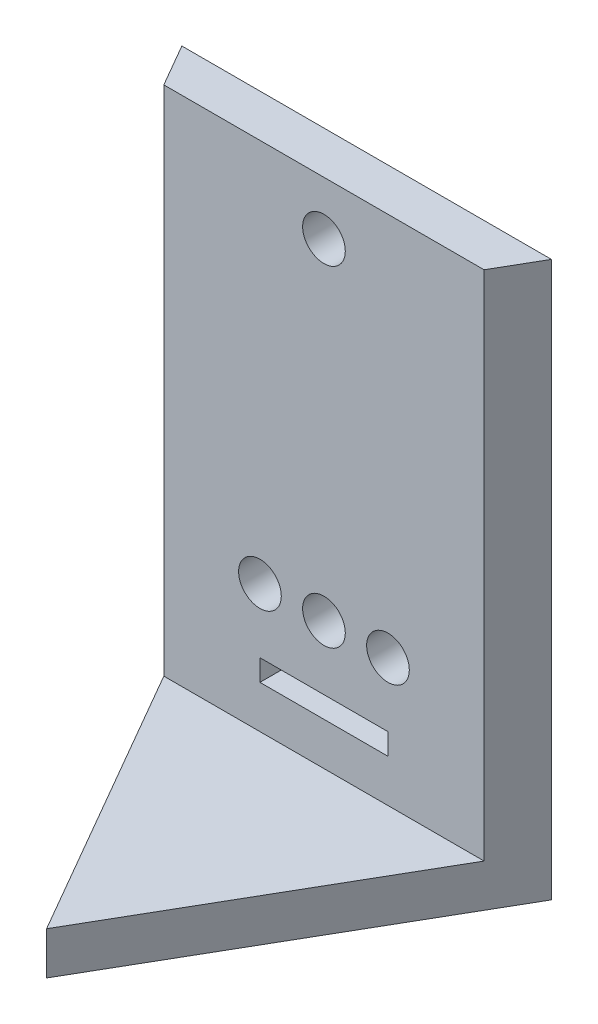
ISO-10303-21;
HEADER;
FILE_DESCRIPTION(('STEP AP214'),'2;1');
FILE_NAME('part.step','',(''),(''),'','','');
FILE_SCHEMA(('AUTOMOTIVE_DESIGN { 1 0 10303 214 1 1 1 1 }'));
ENDSEC;
DATA;
#1=APPLICATION_CONTEXT('core data for automotive mechanical design processes');
#2=APPLICATION_PROTOCOL_DEFINITION('international standard','automotive_design',2000,#1);
#3=PRODUCT_CONTEXT('',#1,'mechanical');
#4=PRODUCT('Part','Part','',(#3));
#5=PRODUCT_RELATED_PRODUCT_CATEGORY('part','',(#4));
#6=PRODUCT_DEFINITION_FORMATION('','',#4);
#7=PRODUCT_DEFINITION_CONTEXT('part definition',#1,'design');
#8=PRODUCT_DEFINITION('design','',#6,#7);
#9=PRODUCT_DEFINITION_SHAPE('','',#8);
#10=(LENGTH_UNIT() NAMED_UNIT(*) SI_UNIT(.MILLI.,.METRE.));
#11=(NAMED_UNIT(*) PLANE_ANGLE_UNIT() SI_UNIT($,.RADIAN.));
#12=(NAMED_UNIT(*) SI_UNIT($,.STERADIAN.) SOLID_ANGLE_UNIT());
#13=UNCERTAINTY_MEASURE_WITH_UNIT(LENGTH_MEASURE(1.E-05),#10,'distance_accuracy_value','');
#14=(GEOMETRIC_REPRESENTATION_CONTEXT(3) GLOBAL_UNCERTAINTY_ASSIGNED_CONTEXT((#13)) GLOBAL_UNIT_ASSIGNED_CONTEXT((#10,
#11,#12)) REPRESENTATION_CONTEXT('',''));
#15=CARTESIAN_POINT('',(0.,0.,0.));
#16=DIRECTION('',(0.,0.,1.));
#17=DIRECTION('',(1.,0.,0.));
#18=AXIS2_PLACEMENT_3D('',#15,#16,#17);
#19=CARTESIAN_POINT('',(43.3012701892219,130.,-75.));
#20=DIRECTION('',(0.,0.,1.));
#21=DIRECTION('',(1.,0.,0.));
#22=AXIS2_PLACEMENT_3D('',#19,#20,#21);
#23=PLANE('',#22);
#24=CARTESIAN_POINT('',(10.,110.,-75.));
#25=DIRECTION('',(0.,0.,1.));
#26=DIRECTION('',(1.,0.,0.));
#27=AXIS2_PLACEMENT_3D('',#24,#25,#26);
#28=CIRCLE('',#27,1.25);
#29=CARTESIAN_POINT('',(11.25,110.,-75.));
#30=VERTEX_POINT('',#29);
#31=EDGE_CURVE('E44',#30,#30,#28,.F.);
#32=ORIENTED_EDGE('',*,*,#31,.F.);
#33=EDGE_LOOP('',(#32));
#34=FACE_BOUND('',#33,.T.);
#35=CARTESIAN_POINT('',(0.,117.5,-75.));
#36=DIRECTION('',(0.,0.,-1.));
#37=DIRECTION('',(-1.,0.,0.));
#38=AXIS2_PLACEMENT_3D('',#35,#36,#37);
#39=CIRCLE('',#38,5.);
#40=CARTESIAN_POINT('',(-5.,117.5,-75.));
#41=VERTEX_POINT('',#40);
#42=EDGE_CURVE('E224',#41,#41,#39,.T.);
#43=ORIENTED_EDGE('',*,*,#42,.F.);
#44=EDGE_LOOP('',(#43));
#45=FACE_BOUND('',#44,.T.);
#46=DIRECTION('',(1.,0.,0.));
#47=VECTOR('',#46,1.);
#48=CARTESIAN_POINT('',(15.,25.,-75.));
#49=LINE('',#48,#47);
#50=CARTESIAN_POINT('',(-15.,25.,-75.));
#51=VERTEX_POINT('',#50);
#52=CARTESIAN_POINT('',(15.,25.,-75.));
#53=VERTEX_POINT('',#52);
#54=EDGE_CURVE('E126',#51,#53,#49,.T.);
#55=ORIENTED_EDGE('',*,*,#54,.F.);
#56=DIRECTION('',(0.,1.,0.));
#57=VECTOR('',#56,1.);
#58=CARTESIAN_POINT('',(-15.,20.,-75.));
#59=LINE('',#58,#57);
#60=CARTESIAN_POINT('',(-15.,20.,-75.));
#61=VERTEX_POINT('',#60);
#62=EDGE_CURVE('E51',#61,#51,#59,.T.);
#63=ORIENTED_EDGE('',*,*,#62,.F.);
#64=DIRECTION('',(-1.,0.,0.));
#65=VECTOR('',#64,1.);
#66=CARTESIAN_POINT('',(15.,20.,-75.));
#67=LINE('',#66,#65);
#68=CARTESIAN_POINT('',(15.,20.,-75.));
#69=VERTEX_POINT('',#68);
#70=EDGE_CURVE('E119',#69,#61,#67,.T.);
#71=ORIENTED_EDGE('',*,*,#70,.F.);
#72=DIRECTION('',(0.,-1.,0.));
#73=VECTOR('',#72,1.);
#74=CARTESIAN_POINT('',(15.,20.,-75.));
#75=LINE('',#74,#73);
#76=EDGE_CURVE('E134',#53,#69,#75,.T.);
#77=ORIENTED_EDGE('',*,*,#76,.F.);
#78=EDGE_LOOP('',(#55,#63,#71,#77));
#79=FACE_BOUND('',#78,.T.);
#80=CARTESIAN_POINT('',(-15.0000000000002,40.,-75.));
#81=DIRECTION('',(0.,0.,-1.));
#82=DIRECTION('',(-1.,0.,0.));
#83=AXIS2_PLACEMENT_3D('',#80,#81,#82);
#84=CIRCLE('',#83,5.);
#85=CARTESIAN_POINT('',(-20.0000000000002,40.,-75.));
#86=VERTEX_POINT('',#85);
#87=EDGE_CURVE('E144',#86,#86,#84,.T.);
#88=ORIENTED_EDGE('',*,*,#87,.F.);
#89=EDGE_LOOP('',(#88));
#90=FACE_BOUND('',#89,.T.);
#91=CARTESIAN_POINT('',(-2.22044604925031E-13,40.,-75.));
#92=DIRECTION('',(0.,0.,-1.));
#93=DIRECTION('',(-1.,0.,0.));
#94=AXIS2_PLACEMENT_3D('',#91,#92,#93);
#95=CIRCLE('',#94,5.00000000000001);
#96=CARTESIAN_POINT('',(-5.00000000000023,40.,-75.));
#97=VERTEX_POINT('',#96);
#98=EDGE_CURVE('E150',#97,#97,#95,.T.);
#99=ORIENTED_EDGE('',*,*,#98,.F.);
#100=EDGE_LOOP('',(#99));
#101=FACE_BOUND('',#100,.T.);
#102=CARTESIAN_POINT('',(14.9999999999998,40.,-75.));
#103=DIRECTION('',(0.,0.,-1.));
#104=DIRECTION('',(-1.,0.,0.));
#105=AXIS2_PLACEMENT_3D('',#102,#103,#104);
#106=CIRCLE('',#105,5.);
#107=CARTESIAN_POINT('',(9.99999999999978,40.,-75.));
#108=VERTEX_POINT('',#107);
#109=EDGE_CURVE('E157',#108,#108,#106,.T.);
#110=ORIENTED_EDGE('',*,*,#109,.F.);
#111=EDGE_LOOP('',(#110));
#112=FACE_BOUND('',#111,.T.);
#113=DIRECTION('',(-1.,0.,0.));
#114=VECTOR('',#113,1.);
#115=CARTESIAN_POINT('',(43.3012701892219,0.,-75.));
#116=LINE('',#115,#114);
#117=CARTESIAN_POINT('',(43.3012701892216,0.,-74.9999999999998));
#118=VERTEX_POINT('',#117);
#119=CARTESIAN_POINT('',(-43.3012701892221,0.,-74.9999999999995));
#120=VERTEX_POINT('',#119);
#121=EDGE_CURVE('E181',#118,#120,#116,.T.);
#122=ORIENTED_EDGE('',*,*,#121,.T.);
#123=DIRECTION('',(0.,-1.,0.));
#124=VECTOR('',#123,1.);
#125=CARTESIAN_POINT('',(-43.3012701892219,130.,-75.));
#126=LINE('',#125,#124);
#127=CARTESIAN_POINT('',(-43.3012701892221,130.,-74.9999999999995));
#128=VERTEX_POINT('',#127);
#129=EDGE_CURVE('E197',#128,#120,#126,.T.);
#130=ORIENTED_EDGE('',*,*,#129,.F.);
#131=DIRECTION('',(-1.,0.,0.));
#132=VECTOR('',#131,1.);
#133=CARTESIAN_POINT('',(43.3012701892219,130.,-75.));
#134=LINE('',#133,#132);
#135=CARTESIAN_POINT('',(43.3012701892216,130.,-74.9999999999998));
#136=VERTEX_POINT('',#135);
#137=EDGE_CURVE('E193',#136,#128,#134,.T.);
#138=ORIENTED_EDGE('',*,*,#137,.F.);
#139=DIRECTION('',(0.,-1.,0.));
#140=VECTOR('',#139,1.);
#141=CARTESIAN_POINT('',(43.3012701892219,130.,-75.));
#142=LINE('',#141,#140);
#143=EDGE_CURVE('E203',#136,#118,#142,.T.);
#144=ORIENTED_EDGE('',*,*,#143,.T.);
#145=EDGE_LOOP('',(#122,#130,#138,#144));
#146=FACE_BOUND('',#145,.T.);
#147=CARTESIAN_POINT('',(10.,85.,-74.9999999999996));
#148=DIRECTION('',(0.,0.,1.));
#149=DIRECTION('',(-1.,0.,0.));
#150=AXIS2_PLACEMENT_3D('',#147,#148,#149);
#151=CIRCLE('',#150,1.25);
#152=CARTESIAN_POINT('',(8.75,85.,-74.9999999999996));
#153=VERTEX_POINT('',#152);
#154=EDGE_CURVE('E239',#153,#153,#151,.T.);
#155=ORIENTED_EDGE('',*,*,#154,.T.);
#156=EDGE_LOOP('',(#155));
#157=FACE_BOUND('',#156,.T.);
#158=CARTESIAN_POINT('',(-10.,110.,-75.));
#159=DIRECTION('',(0.,0.,1.));
#160=DIRECTION('',(1.,0.,0.));
#161=AXIS2_PLACEMENT_3D('',#158,#159,#160);
#162=CIRCLE('',#161,1.25);
#163=CARTESIAN_POINT('',(-8.75,110.,-75.));
#164=VERTEX_POINT('',#163);
#165=EDGE_CURVE('E243',#164,#164,#162,.T.);
#166=ORIENTED_EDGE('',*,*,#165,.T.);
#167=EDGE_LOOP('',(#166));
#168=FACE_BOUND('',#167,.T.);
#169=CARTESIAN_POINT('',(-10.,85.,-75.));
#170=DIRECTION('',(0.,0.,1.));
#171=DIRECTION('',(1.,0.,0.));
#172=AXIS2_PLACEMENT_3D('',#169,#170,#171);
#173=CIRCLE('',#172,1.25);
#174=CARTESIAN_POINT('',(-8.75,85.,-75.));
#175=VERTEX_POINT('',#174);
#176=EDGE_CURVE('E11',#175,#175,#173,.F.);
#177=ORIENTED_EDGE('',*,*,#176,.F.);
#178=EDGE_LOOP('',(#177));
#179=FACE_BOUND('',#178,.T.);
#180=ADVANCED_FACE('F37',(#34,#45,#79,#90,#101,#112,#146,#157,#168,#179),#23,.F.);
#181=CARTESIAN_POINT('',(0.,130.,0.));
#182=DIRECTION('',(0.,1.,0.));
#183=DIRECTION('',(0.,0.,1.));
#184=AXIS2_PLACEMENT_3D('',#181,#182,#183);
#185=PLANE('',#184);
#186=DIRECTION('',(-0.499999999999998,0.,0.86602540378444));
#187=VECTOR('',#186,1.);
#188=CARTESIAN_POINT('',(0.,130.,0.));
#189=LINE('',#188,#187);
#190=CARTESIAN_POINT('',(37.5277674973255,130.,-65.));
#191=VERTEX_POINT('',#190);
#192=EDGE_CURVE('E160',#136,#191,#189,.T.);
#193=ORIENTED_EDGE('',*,*,#192,.F.);
#194=ORIENTED_EDGE('',*,*,#137,.T.);
#195=DIRECTION('',(-0.500000000000004,0.,-0.866025403784436));
#196=VECTOR('',#195,1.);
#197=CARTESIAN_POINT('',(-43.3012701892221,130.,-74.9999999999995));
#198=LINE('',#197,#196);
#199=CARTESIAN_POINT('',(-37.5277674973259,130.,-64.9999999999997));
#200=VERTEX_POINT('',#199);
#201=EDGE_CURVE('E168',#200,#128,#198,.T.);
#202=ORIENTED_EDGE('',*,*,#201,.F.);
#203=DIRECTION('',(-1.,0.,0.));
#204=VECTOR('',#203,1.);
#205=CARTESIAN_POINT('',(43.3012701892219,130.,-65.));
#206=LINE('',#205,#204);
#207=EDGE_CURVE('E186',#191,#200,#206,.T.);
#208=ORIENTED_EDGE('',*,*,#207,.F.);
#209=EDGE_LOOP('',(#193,#194,#202,#208));
#210=FACE_BOUND('',#209,.T.);
#211=ADVANCED_FACE('F220',(#210),#185,.T.);
#212=CARTESIAN_POINT('',(0.,0.,0.));
#213=DIRECTION('',(0.,1.,0.));
#214=DIRECTION('',(0.,0.,1.));
#215=AXIS2_PLACEMENT_3D('',#212,#213,#214);
#216=PLANE('',#215);
#217=ORIENTED_EDGE('',*,*,#121,.F.);
#218=DIRECTION('',(-0.499999999999998,0.,0.86602540378444));
#219=VECTOR('',#218,1.);
#220=CARTESIAN_POINT('',(0.,0.,0.));
#221=LINE('',#220,#219);
#222=CARTESIAN_POINT('',(0.,0.,0.));
#223=VERTEX_POINT('',#222);
#224=EDGE_CURVE('E163',#118,#223,#221,.T.);
#225=ORIENTED_EDGE('',*,*,#224,.T.);
#226=DIRECTION('',(-0.500000000000004,0.,-0.866025403784436));
#227=VECTOR('',#226,1.);
#228=CARTESIAN_POINT('',(-43.3012701892221,0.,-74.9999999999995));
#229=LINE('',#228,#227);
#230=EDGE_CURVE('E167',#223,#120,#229,.T.);
#231=ORIENTED_EDGE('',*,*,#230,.T.);
#232=EDGE_LOOP('',(#217,#225,#231));
#233=FACE_BOUND('',#232,.T.);
#234=ADVANCED_FACE('F318',(#233),#216,.F.);
#235=CARTESIAN_POINT('',(43.3012701892219,130.,-65.));
#236=DIRECTION('',(0.,0.,1.));
#237=DIRECTION('',(1.,0.,0.));
#238=AXIS2_PLACEMENT_3D('',#235,#236,#237);
#239=PLANE('',#238);
#240=CARTESIAN_POINT('',(0.,117.5,-65.));
#241=DIRECTION('',(0.,0.,1.));
#242=DIRECTION('',(1.,0.,0.));
#243=AXIS2_PLACEMENT_3D('',#240,#241,#242);
#244=CIRCLE('',#243,5.);
#245=CARTESIAN_POINT('',(5.,117.5,-65.));
#246=VERTEX_POINT('',#245);
#247=EDGE_CURVE('E537',#246,#246,#244,.F.);
#248=ORIENTED_EDGE('',*,*,#247,.T.);
#249=EDGE_LOOP('',(#248));
#250=FACE_BOUND('',#249,.T.);
#251=DIRECTION('',(0.,1.,0.));
#252=VECTOR('',#251,1.);
#253=CARTESIAN_POINT('',(-15.,20.,-65.));
#254=LINE('',#253,#252);
#255=CARTESIAN_POINT('',(-15.,20.,-65.));
#256=VERTEX_POINT('',#255);
#257=CARTESIAN_POINT('',(-15.,25.,-65.));
#258=VERTEX_POINT('',#257);
#259=EDGE_CURVE('E117',#256,#258,#254,.T.);
#260=ORIENTED_EDGE('',*,*,#259,.T.);
#261=DIRECTION('',(1.,0.,0.));
#262=VECTOR('',#261,1.);
#263=CARTESIAN_POINT('',(15.,25.,-65.));
#264=LINE('',#263,#262);
#265=CARTESIAN_POINT('',(15.,25.,-65.));
#266=VERTEX_POINT('',#265);
#267=EDGE_CURVE('E106',#258,#266,#264,.T.);
#268=ORIENTED_EDGE('',*,*,#267,.T.);
#269=DIRECTION('',(0.,-1.,0.));
#270=VECTOR('',#269,1.);
#271=CARTESIAN_POINT('',(15.,20.,-65.));
#272=LINE('',#271,#270);
#273=CARTESIAN_POINT('',(15.,20.,-65.));
#274=VERTEX_POINT('',#273);
#275=EDGE_CURVE('E128',#266,#274,#272,.T.);
#276=ORIENTED_EDGE('',*,*,#275,.T.);
#277=DIRECTION('',(-1.,0.,0.));
#278=VECTOR('',#277,1.);
#279=CARTESIAN_POINT('',(15.,20.,-65.));
#280=LINE('',#279,#278);
#281=EDGE_CURVE('E124',#274,#256,#280,.T.);
#282=ORIENTED_EDGE('',*,*,#281,.T.);
#283=EDGE_LOOP('',(#260,#268,#276,#282));
#284=FACE_BOUND('',#283,.T.);
#285=CARTESIAN_POINT('',(-15.0000000000002,40.,-65.));
#286=DIRECTION('',(0.,0.,1.));
#287=DIRECTION('',(1.,0.,0.));
#288=AXIS2_PLACEMENT_3D('',#285,#286,#287);
#289=CIRCLE('',#288,5.);
#290=CARTESIAN_POINT('',(-10.0000000000002,40.,-65.));
#291=VERTEX_POINT('',#290);
#292=EDGE_CURVE('E113',#291,#291,#289,.F.);
#293=ORIENTED_EDGE('',*,*,#292,.T.);
#294=EDGE_LOOP('',(#293));
#295=FACE_BOUND('',#294,.T.);
#296=CARTESIAN_POINT('',(-2.22044604925031E-13,40.,-65.));
#297=DIRECTION('',(0.,0.,1.));
#298=DIRECTION('',(1.,0.,0.));
#299=AXIS2_PLACEMENT_3D('',#296,#297,#298);
#300=CIRCLE('',#299,5.00000000000001);
#301=CARTESIAN_POINT('',(4.99999999999978,40.,-65.));
#302=VERTEX_POINT('',#301);
#303=EDGE_CURVE('E147',#302,#302,#300,.F.);
#304=ORIENTED_EDGE('',*,*,#303,.T.);
#305=EDGE_LOOP('',(#304));
#306=FACE_BOUND('',#305,.T.);
#307=CARTESIAN_POINT('',(14.9999999999998,40.,-65.));
#308=DIRECTION('',(0.,0.,1.));
#309=DIRECTION('',(1.,0.,0.));
#310=AXIS2_PLACEMENT_3D('',#307,#308,#309);
#311=CIRCLE('',#310,5.);
#312=CARTESIAN_POINT('',(19.9999999999998,40.,-65.));
#313=VERTEX_POINT('',#312);
#314=EDGE_CURVE('E154',#313,#313,#311,.F.);
#315=ORIENTED_EDGE('',*,*,#314,.T.);
#316=EDGE_LOOP('',(#315));
#317=FACE_BOUND('',#316,.T.);
#318=DIRECTION('',(-1.,0.,0.));
#319=VECTOR('',#318,1.);
#320=CARTESIAN_POINT('',(43.3012701892219,9.99999999999999,-65.));
#321=LINE('',#320,#319);
#322=CARTESIAN_POINT('',(37.5277674973255,10.,-65.));
#323=VERTEX_POINT('',#322);
#324=CARTESIAN_POINT('',(-37.5277674973261,10.,-65.));
#325=VERTEX_POINT('',#324);
#326=EDGE_CURVE('E177',#323,#325,#321,.T.);
#327=ORIENTED_EDGE('',*,*,#326,.F.);
#328=DIRECTION('',(0.,-1.,0.));
#329=VECTOR('',#328,1.);
#330=CARTESIAN_POINT('',(37.5277674973256,130.,-65.));
#331=LINE('',#330,#329);
#332=EDGE_CURVE('E178',#191,#323,#331,.T.);
#333=ORIENTED_EDGE('',*,*,#332,.F.);
#334=ORIENTED_EDGE('',*,*,#207,.T.);
#335=DIRECTION('',(0.,-1.,0.));
#336=VECTOR('',#335,1.);
#337=CARTESIAN_POINT('',(-37.5277674973257,130.,-65.));
#338=LINE('',#337,#336);
#339=EDGE_CURVE('E182',#200,#325,#338,.T.);
#340=ORIENTED_EDGE('',*,*,#339,.T.);
#341=EDGE_LOOP('',(#327,#333,#334,#340));
#342=FACE_BOUND('',#341,.T.);
#343=ADVANCED_FACE('F122',(#250,#284,#295,#306,#317,#342),#239,.T.);
#344=CARTESIAN_POINT('',(0.,10.,0.));
#345=DIRECTION('',(0.,1.,0.));
#346=DIRECTION('',(0.,0.,1.));
#347=AXIS2_PLACEMENT_3D('',#344,#345,#346);
#348=PLANE('',#347);
#349=DIRECTION('',(-0.499999999999998,0.,0.86602540378444));
#350=VECTOR('',#349,1.);
#351=CARTESIAN_POINT('',(0.,10.,0.));
#352=LINE('',#351,#350);
#353=CARTESIAN_POINT('',(0.,10.,0.));
#354=VERTEX_POINT('',#353);
#355=EDGE_CURVE('E210',#323,#354,#352,.T.);
#356=ORIENTED_EDGE('',*,*,#355,.F.);
#357=ORIENTED_EDGE('',*,*,#326,.T.);
#358=DIRECTION('',(-0.500000000000004,0.,-0.866025403784436));
#359=VECTOR('',#358,1.);
#360=CARTESIAN_POINT('',(0.,10.,0.));
#361=LINE('',#360,#359);
#362=EDGE_CURVE('E207',#354,#325,#361,.T.);
#363=ORIENTED_EDGE('',*,*,#362,.F.);
#364=EDGE_LOOP('',(#356,#357,#363));
#365=FACE_BOUND('',#364,.T.);
#366=ADVANCED_FACE('F314',(#365),#348,.T.);
#367=CARTESIAN_POINT('',(0.,0.,0.));
#368=DIRECTION('',(-0.86602540378444,0.,-0.499999999999998));
#369=DIRECTION('',(-0.499999999999998,0.,0.86602540378444));
#370=AXIS2_PLACEMENT_3D('',#367,#368,#369);
#371=PLANE('',#370);
#372=ORIENTED_EDGE('',*,*,#332,.T.);
#373=ORIENTED_EDGE('',*,*,#355,.T.);
#374=DIRECTION('',(0.,1.,0.));
#375=VECTOR('',#374,1.);
#376=CARTESIAN_POINT('',(0.,0.,0.));
#377=LINE('',#376,#375);
#378=EDGE_CURVE('E172',#223,#354,#377,.T.);
#379=ORIENTED_EDGE('',*,*,#378,.F.);
#380=ORIENTED_EDGE('',*,*,#224,.F.);
#381=ORIENTED_EDGE('',*,*,#143,.F.);
#382=ORIENTED_EDGE('',*,*,#192,.T.);
#383=EDGE_LOOP('',(#372,#373,#379,#380,#381,#382));
#384=FACE_BOUND('',#383,.T.);
#385=ADVANCED_FACE('F310',(#384),#371,.F.);
#386=CARTESIAN_POINT('',(-43.3012701892221,0.,-74.9999999999995));
#387=DIRECTION('',(0.866025403784436,0.,-0.500000000000004));
#388=DIRECTION('',(-0.500000000000004,0.,-0.866025403784436));
#389=AXIS2_PLACEMENT_3D('',#386,#387,#388);
#390=PLANE('',#389);
#391=ORIENTED_EDGE('',*,*,#339,.F.);
#392=ORIENTED_EDGE('',*,*,#201,.T.);
#393=ORIENTED_EDGE('',*,*,#129,.T.);
#394=ORIENTED_EDGE('',*,*,#230,.F.);
#395=ORIENTED_EDGE('',*,*,#378,.T.);
#396=ORIENTED_EDGE('',*,*,#362,.T.);
#397=EDGE_LOOP('',(#391,#392,#393,#394,#395,#396));
#398=FACE_BOUND('',#397,.T.);
#399=ADVANCED_FACE('F306',(#398),#390,.F.);
#400=CARTESIAN_POINT('',(14.9999999999998,40.,0.001000000000001));
#401=DIRECTION('',(0.,0.,-1.));
#402=DIRECTION('',(-1.,0.,0.));
#403=AXIS2_PLACEMENT_3D('',#400,#401,#402);
#404=CYLINDRICAL_SURFACE('',#403,5.);
#405=ORIENTED_EDGE('',*,*,#314,.F.);
#406=EDGE_LOOP('',(#405));
#407=FACE_BOUND('',#406,.T.);
#408=ORIENTED_EDGE('',*,*,#109,.T.);
#409=EDGE_LOOP('',(#408));
#410=FACE_BOUND('',#409,.T.);
#411=ADVANCED_FACE('F302',(#407,#410),#404,.F.);
#412=CARTESIAN_POINT('',(-2.22044604925031E-13,40.,0.001000000000001));
#413=DIRECTION('',(0.,0.,-1.));
#414=DIRECTION('',(-1.,0.,0.));
#415=AXIS2_PLACEMENT_3D('',#412,#413,#414);
#416=CYLINDRICAL_SURFACE('',#415,5.00000000000001);
#417=ORIENTED_EDGE('',*,*,#303,.F.);
#418=EDGE_LOOP('',(#417));
#419=FACE_BOUND('',#418,.T.);
#420=ORIENTED_EDGE('',*,*,#98,.T.);
#421=EDGE_LOOP('',(#420));
#422=FACE_BOUND('',#421,.T.);
#423=ADVANCED_FACE('F298',(#419,#422),#416,.F.);
#424=CARTESIAN_POINT('',(-15.0000000000002,40.,0.001000000000001));
#425=DIRECTION('',(0.,0.,-1.));
#426=DIRECTION('',(-1.,0.,0.));
#427=AXIS2_PLACEMENT_3D('',#424,#425,#426);
#428=CYLINDRICAL_SURFACE('',#427,5.);
#429=ORIENTED_EDGE('',*,*,#292,.F.);
#430=EDGE_LOOP('',(#429));
#431=FACE_BOUND('',#430,.T.);
#432=ORIENTED_EDGE('',*,*,#87,.T.);
#433=EDGE_LOOP('',(#432));
#434=FACE_BOUND('',#433,.T.);
#435=ADVANCED_FACE('F295',(#431,#434),#428,.F.);
#436=CARTESIAN_POINT('',(-15.,20.,0.001000000000001));
#437=DIRECTION('',(-1.,0.,0.));
#438=DIRECTION('',(0.,0.,1.));
#439=AXIS2_PLACEMENT_3D('',#436,#437,#438);
#440=PLANE('',#439);
#441=DIRECTION('',(0.,0.,-1.));
#442=VECTOR('',#441,1.);
#443=CARTESIAN_POINT('',(-15.,20.,0.001000000000001));
#444=LINE('',#443,#442);
#445=EDGE_CURVE('E114',#256,#61,#444,.T.);
#446=ORIENTED_EDGE('',*,*,#445,.T.);
#447=ORIENTED_EDGE('',*,*,#62,.T.);
#448=DIRECTION('',(0.,0.,-1.));
#449=VECTOR('',#448,1.);
#450=CARTESIAN_POINT('',(-15.,25.,0.001000000000001));
#451=LINE('',#450,#449);
#452=EDGE_CURVE('E108',#258,#51,#451,.T.);
#453=ORIENTED_EDGE('',*,*,#452,.F.);
#454=ORIENTED_EDGE('',*,*,#259,.F.);
#455=EDGE_LOOP('',(#446,#447,#453,#454));
#456=FACE_BOUND('',#455,.T.);
#457=ADVANCED_FACE('F116',(#456),#440,.F.);
#458=CARTESIAN_POINT('',(15.,20.,0.001000000000001));
#459=DIRECTION('',(0.,-1.,0.));
#460=DIRECTION('',(0.,0.,-1.));
#461=AXIS2_PLACEMENT_3D('',#458,#459,#460);
#462=PLANE('',#461);
#463=DIRECTION('',(0.,0.,-1.));
#464=VECTOR('',#463,1.);
#465=CARTESIAN_POINT('',(15.,20.,0.001000000000001));
#466=LINE('',#465,#464);
#467=EDGE_CURVE('E141',#274,#69,#466,.T.);
#468=ORIENTED_EDGE('',*,*,#467,.T.);
#469=ORIENTED_EDGE('',*,*,#70,.T.);
#470=ORIENTED_EDGE('',*,*,#445,.F.);
#471=ORIENTED_EDGE('',*,*,#281,.F.);
#472=EDGE_LOOP('',(#468,#469,#470,#471));
#473=FACE_BOUND('',#472,.T.);
#474=ADVANCED_FACE('F283',(#473),#462,.F.);
#475=CARTESIAN_POINT('',(15.,20.,0.001000000000001));
#476=DIRECTION('',(1.,0.,0.));
#477=DIRECTION('',(0.,1.,0.));
#478=AXIS2_PLACEMENT_3D('',#475,#476,#477);
#479=PLANE('',#478);
#480=DIRECTION('',(0.,0.,-1.));
#481=VECTOR('',#480,1.);
#482=CARTESIAN_POINT('',(15.,25.,0.001000000000001));
#483=LINE('',#482,#481);
#484=EDGE_CURVE('E59',#266,#53,#483,.T.);
#485=ORIENTED_EDGE('',*,*,#484,.T.);
#486=ORIENTED_EDGE('',*,*,#76,.T.);
#487=ORIENTED_EDGE('',*,*,#467,.F.);
#488=ORIENTED_EDGE('',*,*,#275,.F.);
#489=EDGE_LOOP('',(#485,#486,#487,#488));
#490=FACE_BOUND('',#489,.T.);
#491=ADVANCED_FACE('F286',(#490),#479,.F.);
#492=CARTESIAN_POINT('',(15.,25.,0.001000000000001));
#493=DIRECTION('',(0.,1.,0.));
#494=DIRECTION('',(0.,0.,1.));
#495=AXIS2_PLACEMENT_3D('',#492,#493,#494);
#496=PLANE('',#495);
#497=ORIENTED_EDGE('',*,*,#452,.T.);
#498=ORIENTED_EDGE('',*,*,#54,.T.);
#499=ORIENTED_EDGE('',*,*,#484,.F.);
#500=ORIENTED_EDGE('',*,*,#267,.F.);
#501=EDGE_LOOP('',(#497,#498,#499,#500));
#502=FACE_BOUND('',#501,.T.);
#503=ADVANCED_FACE('F107',(#502),#496,.F.);
#504=CARTESIAN_POINT('',(0.,117.5,0.001000000000001));
#505=DIRECTION('',(0.,0.,-1.));
#506=DIRECTION('',(-1.,0.,0.));
#507=AXIS2_PLACEMENT_3D('',#504,#505,#506);
#508=CYLINDRICAL_SURFACE('',#507,5.);
#509=ORIENTED_EDGE('',*,*,#247,.F.);
#510=EDGE_LOOP('',(#509));
#511=FACE_BOUND('',#510,.T.);
#512=ORIENTED_EDGE('',*,*,#42,.T.);
#513=EDGE_LOOP('',(#512));
#514=FACE_BOUND('',#513,.T.);
#515=ADVANCED_FACE('F278',(#511,#514),#508,.F.);
#516=CARTESIAN_POINT('',(10.,85.,-76.9999999999996));
#517=DIRECTION('',(0.,0.,1.));
#518=DIRECTION('',(1.,0.,0.));
#519=AXIS2_PLACEMENT_3D('',#516,#517,#518);
#520=CYLINDRICAL_SURFACE('',#519,1.25);
#521=CARTESIAN_POINT('',(10.,85.,-76.9999999999996));
#522=DIRECTION('',(0.,0.,1.));
#523=DIRECTION('',(-1.,0.,0.));
#524=AXIS2_PLACEMENT_3D('',#521,#522,#523);
#525=CIRCLE('',#524,1.25);
#526=CARTESIAN_POINT('',(10.,83.75,-76.9999999999995));
#527=VERTEX_POINT('',#526);
#528=EDGE_CURVE('E533',#527,#527,#525,.T.);
#529=ORIENTED_EDGE('',*,*,#528,.T.);
#530=EDGE_LOOP('',(#529));
#531=FACE_BOUND('',#530,.T.);
#532=ORIENTED_EDGE('',*,*,#154,.F.);
#533=EDGE_LOOP('',(#532));
#534=FACE_BOUND('',#533,.T.);
#535=ADVANCED_FACE('F274',(#531,#534),#520,.T.);
#536=CARTESIAN_POINT('',(10.,88.,-76.9999999999998));
#537=DIRECTION('',(-1.,0.,0.));
#538=DIRECTION('',(0.,0.,1.));
#539=AXIS2_PLACEMENT_3D('',#536,#537,#538);
#540=TOROIDAL_SURFACE('',#539,2.99999999999999,1.25);
#541=CARTESIAN_POINT('',(10.,87.9999999999998,-79.9999999999998));
#542=DIRECTION('',(0.,-1.,0.));
#543=DIRECTION('',(-1.,0.,0.));
#544=AXIS2_PLACEMENT_3D('',#541,#542,#543);
#545=CIRCLE('',#544,1.25);
#546=CARTESIAN_POINT('',(10.,87.9999999999997,-81.2499999999998));
#547=VERTEX_POINT('',#546);
#548=EDGE_CURVE('E530',#547,#547,#545,.T.);
#549=CARTESIAN_POINT('',(10.,88.,-76.9999999999998));
#550=DIRECTION('',(-1.,0.,0.));
#551=DIRECTION('',(0.,0.,1.));
#552=AXIS2_PLACEMENT_3D('',#549,#550,#551);
#553=CIRCLE('',#552,4.24999999999999);
#554=EDGE_CURVE('',#547,#527,#553,.T.);
#555=ORIENTED_EDGE('',*,*,#548,.T.);
#556=ORIENTED_EDGE('',*,*,#528,.F.);
#557=ORIENTED_EDGE('',*,*,#554,.T.);
#558=ORIENTED_EDGE('',*,*,#554,.F.);
#559=EDGE_LOOP('',(#555,#557,#556,#558));
#560=FACE_BOUND('',#559,.T.);
#561=ADVANCED_FACE('F270',(#560),#540,.T.);
#562=CARTESIAN_POINT('',(10.,107.,-79.9999999999998));
#563=DIRECTION('',(0.,-1.,0.));
#564=DIRECTION('',(0.,0.,-1.));
#565=AXIS2_PLACEMENT_3D('',#562,#563,#564);
#566=CYLINDRICAL_SURFACE('',#565,1.25);
#567=CARTESIAN_POINT('',(10.,107.,-79.9999999999998));
#568=DIRECTION('',(0.,-1.,0.));
#569=DIRECTION('',(-1.,0.,0.));
#570=AXIS2_PLACEMENT_3D('',#567,#568,#569);
#571=CIRCLE('',#570,1.25);
#572=CARTESIAN_POINT('',(10.,107.,-81.2499999999998));
#573=VERTEX_POINT('',#572);
#574=EDGE_CURVE('E527',#573,#573,#571,.T.);
#575=ORIENTED_EDGE('',*,*,#574,.T.);
#576=EDGE_LOOP('',(#575));
#577=FACE_BOUND('',#576,.T.);
#578=ORIENTED_EDGE('',*,*,#548,.F.);
#579=EDGE_LOOP('',(#578));
#580=FACE_BOUND('',#579,.T.);
#581=ADVANCED_FACE('F266',(#577,#580),#566,.T.);
#582=CARTESIAN_POINT('',(10.,107.,-76.9999999999998));
#583=DIRECTION('',(-1.,0.,0.));
#584=DIRECTION('',(0.,0.,1.));
#585=AXIS2_PLACEMENT_3D('',#582,#583,#584);
#586=TOROIDAL_SURFACE('',#585,3.,1.25);
#587=CARTESIAN_POINT('',(10.,110.,-77.));
#588=DIRECTION('',(0.,0.,-1.));
#589=DIRECTION('',(-1.,0.,0.));
#590=AXIS2_PLACEMENT_3D('',#587,#588,#589);
#591=CIRCLE('',#590,1.25);
#592=CARTESIAN_POINT('',(10.,111.25,-77.0000000000001));
#593=VERTEX_POINT('',#592);
#594=EDGE_CURVE('E523',#593,#593,#591,.T.);
#595=CARTESIAN_POINT('',(10.,107.,-76.9999999999998));
#596=DIRECTION('',(-1.,0.,0.));
#597=DIRECTION('',(0.,0.,1.));
#598=AXIS2_PLACEMENT_3D('',#595,#596,#597);
#599=CIRCLE('',#598,4.25);
#600=EDGE_CURVE('',#593,#573,#599,.T.);
#601=ORIENTED_EDGE('',*,*,#594,.T.);
#602=ORIENTED_EDGE('',*,*,#574,.F.);
#603=ORIENTED_EDGE('',*,*,#600,.T.);
#604=ORIENTED_EDGE('',*,*,#600,.F.);
#605=EDGE_LOOP('',(#601,#603,#602,#604));
#606=FACE_BOUND('',#605,.T.);
#607=ADVANCED_FACE('F258',(#606),#586,.T.);
#608=CARTESIAN_POINT('',(10.,110.,-77.));
#609=DIRECTION('',(0.,0.,1.));
#610=DIRECTION('',(1.,0.,0.));
#611=AXIS2_PLACEMENT_3D('',#608,#609,#610);
#612=CYLINDRICAL_SURFACE('',#611,1.25);
#613=ORIENTED_EDGE('',*,*,#594,.F.);
#614=EDGE_LOOP('',(#613));
#615=FACE_BOUND('',#614,.T.);
#616=ORIENTED_EDGE('',*,*,#31,.T.);
#617=EDGE_LOOP('',(#616));
#618=FACE_BOUND('',#617,.T.);
#619=ADVANCED_FACE('F216',(#615,#618),#612,.T.);
#620=CARTESIAN_POINT('',(-10.,85.,-76.9999999999996));
#621=DIRECTION('',(0.,0.,1.));
#622=DIRECTION('',(1.,0.,0.));
#623=AXIS2_PLACEMENT_3D('',#620,#621,#622);
#624=CYLINDRICAL_SURFACE('',#623,1.25);
#625=CARTESIAN_POINT('',(-10.,85.,-76.9999999999996));
#626=DIRECTION('',(0.,0.,-1.));
#627=DIRECTION('',(1.,0.,0.));
#628=AXIS2_PLACEMENT_3D('',#625,#626,#627);
#629=CIRCLE('',#628,1.25);
#630=CARTESIAN_POINT('',(-10.,83.75,-76.9999999999995));
#631=VERTEX_POINT('',#630);
#632=EDGE_CURVE('E520',#631,#631,#629,.T.);
#633=ORIENTED_EDGE('',*,*,#632,.F.);
#634=EDGE_LOOP('',(#633));
#635=FACE_BOUND('',#634,.T.);
#636=ORIENTED_EDGE('',*,*,#176,.T.);
#637=EDGE_LOOP('',(#636));
#638=FACE_BOUND('',#637,.T.);
#639=ADVANCED_FACE('F246',(#635,#638),#624,.T.);
#640=CARTESIAN_POINT('',(-10.,88.,-76.9999999999998));
#641=DIRECTION('',(-1.,0.,0.));
#642=DIRECTION('',(0.,0.,1.));
#643=AXIS2_PLACEMENT_3D('',#640,#641,#642);
#644=TOROIDAL_SURFACE('',#643,2.99999999999999,1.25);
#645=CARTESIAN_POINT('',(-10.,87.9999999999998,-79.9999999999998));
#646=DIRECTION('',(0.,1.,0.));
#647=DIRECTION('',(1.,0.,0.));
#648=AXIS2_PLACEMENT_3D('',#645,#646,#647);
#649=CIRCLE('',#648,1.25);
#650=CARTESIAN_POINT('',(-10.,87.9999999999997,-81.2499999999998));
#651=VERTEX_POINT('',#650);
#652=EDGE_CURVE('E517',#651,#651,#649,.T.);
#653=CARTESIAN_POINT('',(-10.,88.,-76.9999999999998));
#654=DIRECTION('',(-1.,0.,0.));
#655=DIRECTION('',(0.,0.,1.));
#656=AXIS2_PLACEMENT_3D('',#653,#654,#655);
#657=CIRCLE('',#656,4.24999999999999);
#658=EDGE_CURVE('',#651,#631,#657,.T.);
#659=ORIENTED_EDGE('',*,*,#652,.F.);
#660=ORIENTED_EDGE('',*,*,#632,.T.);
#661=ORIENTED_EDGE('',*,*,#658,.T.);
#662=ORIENTED_EDGE('',*,*,#658,.F.);
#663=EDGE_LOOP('',(#659,#661,#660,#662));
#664=FACE_BOUND('',#663,.T.);
#665=ADVANCED_FACE('F248',(#664),#644,.T.);
#666=CARTESIAN_POINT('',(-10.,107.,-79.9999999999998));
#667=DIRECTION('',(0.,-1.,0.));
#668=DIRECTION('',(0.,0.,-1.));
#669=AXIS2_PLACEMENT_3D('',#666,#667,#668);
#670=CYLINDRICAL_SURFACE('',#669,1.25);
#671=CARTESIAN_POINT('',(-10.,107.,-79.9999999999998));
#672=DIRECTION('',(0.,1.,0.));
#673=DIRECTION('',(1.,0.,0.));
#674=AXIS2_PLACEMENT_3D('',#671,#672,#673);
#675=CIRCLE('',#674,1.25);
#676=CARTESIAN_POINT('',(-10.,107.,-81.2499999999998));
#677=VERTEX_POINT('',#676);
#678=EDGE_CURVE('E512',#677,#677,#675,.T.);
#679=ORIENTED_EDGE('',*,*,#678,.F.);
#680=EDGE_LOOP('',(#679));
#681=FACE_BOUND('',#680,.T.);
#682=ORIENTED_EDGE('',*,*,#652,.T.);
#683=EDGE_LOOP('',(#682));
#684=FACE_BOUND('',#683,.T.);
#685=ADVANCED_FACE('F255',(#681,#684),#670,.T.);
#686=CARTESIAN_POINT('',(-10.,107.,-76.9999999999998));
#687=DIRECTION('',(-1.,0.,0.));
#688=DIRECTION('',(0.,0.,1.));
#689=AXIS2_PLACEMENT_3D('',#686,#687,#688);
#690=TOROIDAL_SURFACE('',#689,3.,1.25);
#691=CARTESIAN_POINT('',(-10.,110.,-77.));
#692=DIRECTION('',(0.,0.,1.));
#693=DIRECTION('',(1.,0.,0.));
#694=AXIS2_PLACEMENT_3D('',#691,#692,#693);
#695=CIRCLE('',#694,1.25);
#696=CARTESIAN_POINT('',(-10.,111.25,-77.0000000000001));
#697=VERTEX_POINT('',#696);
#698=EDGE_CURVE('E510',#697,#697,#695,.T.);
#699=CARTESIAN_POINT('',(-10.,107.,-76.9999999999998));
#700=DIRECTION('',(-1.,0.,0.));
#701=DIRECTION('',(0.,0.,1.));
#702=AXIS2_PLACEMENT_3D('',#699,#700,#701);
#703=CIRCLE('',#702,4.25);
#704=EDGE_CURVE('',#697,#677,#703,.T.);
#705=ORIENTED_EDGE('',*,*,#698,.F.);
#706=ORIENTED_EDGE('',*,*,#678,.T.);
#707=ORIENTED_EDGE('',*,*,#704,.T.);
#708=ORIENTED_EDGE('',*,*,#704,.F.);
#709=EDGE_LOOP('',(#705,#707,#706,#708));
#710=FACE_BOUND('',#709,.T.);
#711=ADVANCED_FACE('F484',(#710),#690,.T.);
#712=CARTESIAN_POINT('',(-10.,110.,-77.));
#713=DIRECTION('',(0.,0.,1.));
#714=DIRECTION('',(1.,0.,0.));
#715=AXIS2_PLACEMENT_3D('',#712,#713,#714);
#716=CYLINDRICAL_SURFACE('',#715,1.25);
#717=ORIENTED_EDGE('',*,*,#698,.T.);
#718=EDGE_LOOP('',(#717));
#719=FACE_BOUND('',#718,.T.);
#720=ORIENTED_EDGE('',*,*,#165,.F.);
#721=EDGE_LOOP('',(#720));
#722=FACE_BOUND('',#721,.T.);
#723=ADVANCED_FACE('F493',(#719,#722),#716,.T.);
#724=CLOSED_SHELL('',(#180,#211,#234,#343,#366,#385,#399,#411,#423,#435,#457,#474,#491,#503,
#515,#535,#561,#581,#607,#619,#639,#665,#685,#711,#723));
#725=MANIFOLD_SOLID_BREP('B2',#724);
#726=ADVANCED_BREP_SHAPE_REPRESENTATION('',(#18,#725),#14);
#727=SHAPE_DEFINITION_REPRESENTATION(#9,#726);
ENDSEC;
END-ISO-10303-21;
